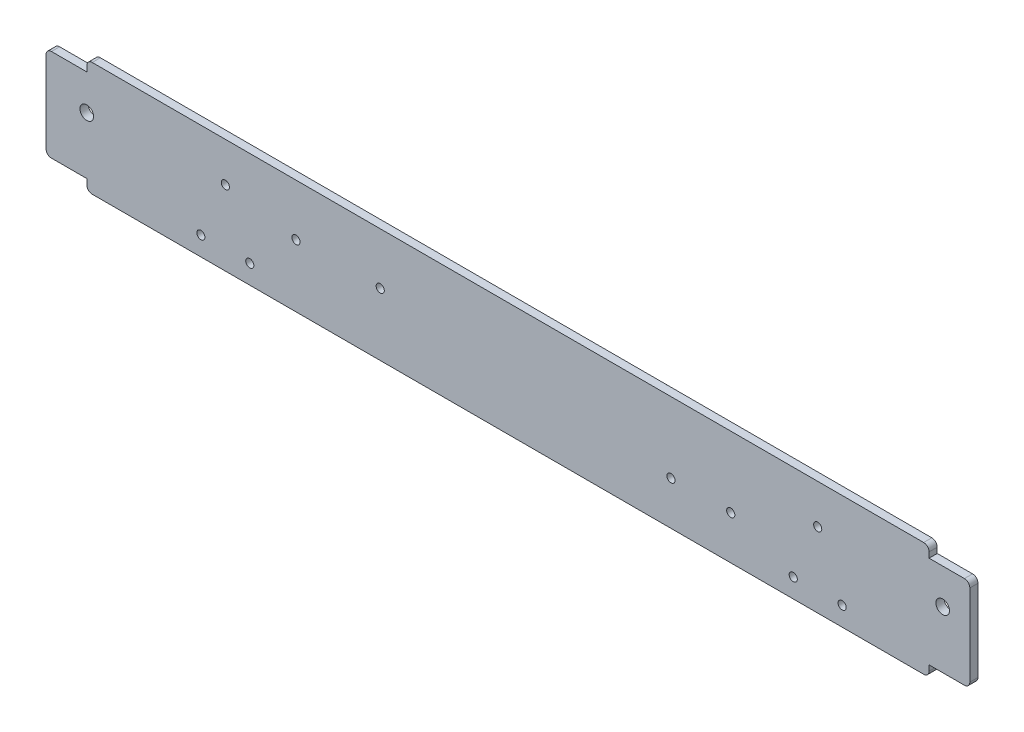
ISO-10303-21;
HEADER;
FILE_DESCRIPTION(('STEP AP214'),'2;1');
FILE_NAME('part.step','',(''),(''),'','','');
FILE_SCHEMA(('AUTOMOTIVE_DESIGN { 1 0 10303 214 1 1 1 1 }'));
ENDSEC;
DATA;
#1=APPLICATION_CONTEXT('core data for automotive mechanical design processes');
#2=APPLICATION_PROTOCOL_DEFINITION('international standard','automotive_design',2000,#1);
#3=PRODUCT_CONTEXT('',#1,'mechanical');
#4=PRODUCT('Part','Part','',(#3));
#5=PRODUCT_RELATED_PRODUCT_CATEGORY('part','',(#4));
#6=PRODUCT_DEFINITION_FORMATION('','',#4);
#7=PRODUCT_DEFINITION_CONTEXT('part definition',#1,'design');
#8=PRODUCT_DEFINITION('design','',#6,#7);
#9=PRODUCT_DEFINITION_SHAPE('','',#8);
#10=(LENGTH_UNIT() NAMED_UNIT(*) SI_UNIT(.MILLI.,.METRE.));
#11=(NAMED_UNIT(*) PLANE_ANGLE_UNIT() SI_UNIT($,.RADIAN.));
#12=(NAMED_UNIT(*) SI_UNIT($,.STERADIAN.) SOLID_ANGLE_UNIT());
#13=UNCERTAINTY_MEASURE_WITH_UNIT(LENGTH_MEASURE(1.E-05),#10,'distance_accuracy_value','');
#14=(GEOMETRIC_REPRESENTATION_CONTEXT(3) GLOBAL_UNCERTAINTY_ASSIGNED_CONTEXT((#13)) GLOBAL_UNIT_ASSIGNED_CONTEXT((#10,
#11,#12)) REPRESENTATION_CONTEXT('',''));
#15=CARTESIAN_POINT('',(0.,0.,0.));
#16=DIRECTION('',(0.,0.,1.));
#17=DIRECTION('',(1.,0.,0.));
#18=AXIS2_PLACEMENT_3D('',#15,#16,#17);
#19=CARTESIAN_POINT('',(0.,0.,3.));
#20=DIRECTION('',(0.,0.,1.));
#21=DIRECTION('',(1.,0.,0.));
#22=AXIS2_PLACEMENT_3D('',#19,#20,#21);
#23=PLANE('',#22);
#24=DIRECTION('',(0.,-1.,0.));
#25=VECTOR('',#24,1.);
#26=CARTESIAN_POINT('',(155.,17.,3.));
#27=LINE('',#26,#25);
#28=CARTESIAN_POINT('',(155.,19.,3.));
#29=VERTEX_POINT('',#28);
#30=CARTESIAN_POINT('',(155.,17.,3.));
#31=VERTEX_POINT('',#30);
#32=EDGE_CURVE('E201',#29,#31,#27,.T.);
#33=ORIENTED_EDGE('',*,*,#32,.F.);
#34=CARTESIAN_POINT('',(153.,19.,3.));
#35=DIRECTION('',(0.,0.,1.));
#36=DIRECTION('',(1.,0.,0.));
#37=AXIS2_PLACEMENT_3D('',#34,#35,#36);
#38=CIRCLE('',#37,2.);
#39=CARTESIAN_POINT('',(153.,21.,3.));
#40=VERTEX_POINT('',#39);
#41=EDGE_CURVE('E363',#29,#40,#38,.T.);
#42=ORIENTED_EDGE('',*,*,#41,.T.);
#43=DIRECTION('',(-1.,0.,0.));
#44=VECTOR('',#43,1.);
#45=CARTESIAN_POINT('',(-170.,21.,3.));
#46=LINE('',#45,#44);
#47=CARTESIAN_POINT('',(-153.,21.,3.));
#48=VERTEX_POINT('',#47);
#49=EDGE_CURVE('E327',#40,#48,#46,.T.);
#50=ORIENTED_EDGE('',*,*,#49,.T.);
#51=CARTESIAN_POINT('',(-153.,19.,3.));
#52=DIRECTION('',(0.,0.,1.));
#53=DIRECTION('',(1.,0.,0.));
#54=AXIS2_PLACEMENT_3D('',#51,#52,#53);
#55=CIRCLE('',#54,2.);
#56=CARTESIAN_POINT('',(-155.,19.,3.));
#57=VERTEX_POINT('',#56);
#58=EDGE_CURVE('E355',#48,#57,#55,.T.);
#59=ORIENTED_EDGE('',*,*,#58,.T.);
#60=DIRECTION('',(0.,-1.,0.));
#61=VECTOR('',#60,1.);
#62=CARTESIAN_POINT('',(-155.,17.,3.));
#63=LINE('',#62,#61);
#64=CARTESIAN_POINT('',(-155.,17.,3.));
#65=VERTEX_POINT('',#64);
#66=EDGE_CURVE('E230',#57,#65,#63,.T.);
#67=ORIENTED_EDGE('',*,*,#66,.T.);
#68=DIRECTION('',(-1.,0.,0.));
#69=VECTOR('',#68,1.);
#70=CARTESIAN_POINT('',(-170.,17.,3.));
#71=LINE('',#70,#69);
#72=CARTESIAN_POINT('',(-168.,17.,3.));
#73=VERTEX_POINT('',#72);
#74=EDGE_CURVE('E226',#65,#73,#71,.T.);
#75=ORIENTED_EDGE('',*,*,#74,.T.);
#76=CARTESIAN_POINT('',(-168.,15.,3.));
#77=DIRECTION('',(0.,0.,1.));
#78=DIRECTION('',(1.,0.,0.));
#79=AXIS2_PLACEMENT_3D('',#76,#77,#78);
#80=CIRCLE('',#79,2.);
#81=CARTESIAN_POINT('',(-170.,15.,3.));
#82=VERTEX_POINT('',#81);
#83=EDGE_CURVE('E353',#73,#82,#80,.T.);
#84=ORIENTED_EDGE('',*,*,#83,.T.);
#85=DIRECTION('',(0.,-1.,0.));
#86=VECTOR('',#85,1.);
#87=CARTESIAN_POINT('',(-170.,21.,3.));
#88=LINE('',#87,#86);
#89=CARTESIAN_POINT('',(-170.,-15.,3.));
#90=VERTEX_POINT('',#89);
#91=EDGE_CURVE('E331',#82,#90,#88,.T.);
#92=ORIENTED_EDGE('',*,*,#91,.T.);
#93=CARTESIAN_POINT('',(-168.,-15.,3.));
#94=DIRECTION('',(0.,0.,1.));
#95=DIRECTION('',(1.,0.,0.));
#96=AXIS2_PLACEMENT_3D('',#93,#94,#95);
#97=CIRCLE('',#96,2.);
#98=CARTESIAN_POINT('',(-168.,-17.,3.));
#99=VERTEX_POINT('',#98);
#100=EDGE_CURVE('E349',#90,#99,#97,.T.);
#101=ORIENTED_EDGE('',*,*,#100,.T.);
#102=DIRECTION('',(-1.,0.,0.));
#103=VECTOR('',#102,1.);
#104=CARTESIAN_POINT('',(-170.,-17.,3.));
#105=LINE('',#104,#103);
#106=CARTESIAN_POINT('',(-155.,-17.,3.));
#107=VERTEX_POINT('',#106);
#108=EDGE_CURVE('E242',#107,#99,#105,.T.);
#109=ORIENTED_EDGE('',*,*,#108,.F.);
#110=DIRECTION('',(0.,1.,0.));
#111=VECTOR('',#110,1.);
#112=CARTESIAN_POINT('',(-155.,-17.,3.));
#113=LINE('',#112,#111);
#114=CARTESIAN_POINT('',(-155.,-19.,3.));
#115=VERTEX_POINT('',#114);
#116=EDGE_CURVE('E238',#115,#107,#113,.T.);
#117=ORIENTED_EDGE('',*,*,#116,.F.);
#118=CARTESIAN_POINT('',(-153.,-19.,3.));
#119=DIRECTION('',(0.,0.,1.));
#120=DIRECTION('',(1.,0.,0.));
#121=AXIS2_PLACEMENT_3D('',#118,#119,#120);
#122=CIRCLE('',#121,2.);
#123=CARTESIAN_POINT('',(-153.,-21.,3.));
#124=VERTEX_POINT('',#123);
#125=EDGE_CURVE('E351',#115,#124,#122,.T.);
#126=ORIENTED_EDGE('',*,*,#125,.T.);
#127=DIRECTION('',(1.,0.,0.));
#128=VECTOR('',#127,1.);
#129=CARTESIAN_POINT('',(-170.,-21.,3.));
#130=LINE('',#129,#128);
#131=CARTESIAN_POINT('',(153.,-21.,3.));
#132=VERTEX_POINT('',#131);
#133=EDGE_CURVE('E334',#124,#132,#130,.T.);
#134=ORIENTED_EDGE('',*,*,#133,.T.);
#135=CARTESIAN_POINT('',(153.,-19.,3.));
#136=DIRECTION('',(0.,0.,1.));
#137=DIRECTION('',(1.,0.,0.));
#138=AXIS2_PLACEMENT_3D('',#135,#136,#137);
#139=CIRCLE('',#138,2.);
#140=CARTESIAN_POINT('',(155.,-19.,3.));
#141=VERTEX_POINT('',#140);
#142=EDGE_CURVE('E357',#132,#141,#139,.T.);
#143=ORIENTED_EDGE('',*,*,#142,.T.);
#144=DIRECTION('',(0.,1.,0.));
#145=VECTOR('',#144,1.);
#146=CARTESIAN_POINT('',(155.,-17.,3.));
#147=LINE('',#146,#145);
#148=CARTESIAN_POINT('',(155.,-17.,3.));
#149=VERTEX_POINT('',#148);
#150=EDGE_CURVE('E218',#141,#149,#147,.T.);
#151=ORIENTED_EDGE('',*,*,#150,.T.);
#152=DIRECTION('',(1.,0.,0.));
#153=VECTOR('',#152,1.);
#154=CARTESIAN_POINT('',(170.,-17.,3.));
#155=LINE('',#154,#153);
#156=CARTESIAN_POINT('',(168.,-17.,3.));
#157=VERTEX_POINT('',#156);
#158=EDGE_CURVE('E205',#149,#157,#155,.T.);
#159=ORIENTED_EDGE('',*,*,#158,.T.);
#160=CARTESIAN_POINT('',(168.,-15.,3.));
#161=DIRECTION('',(0.,0.,1.));
#162=DIRECTION('',(1.,0.,0.));
#163=AXIS2_PLACEMENT_3D('',#160,#161,#162);
#164=CIRCLE('',#163,2.);
#165=CARTESIAN_POINT('',(170.,-15.,3.));
#166=VERTEX_POINT('',#165);
#167=EDGE_CURVE('E359',#157,#166,#164,.T.);
#168=ORIENTED_EDGE('',*,*,#167,.T.);
#169=DIRECTION('',(0.,1.,0.));
#170=VECTOR('',#169,1.);
#171=CARTESIAN_POINT('',(170.,21.,3.));
#172=LINE('',#171,#170);
#173=CARTESIAN_POINT('',(170.,15.,3.));
#174=VERTEX_POINT('',#173);
#175=EDGE_CURVE('E324',#166,#174,#172,.T.);
#176=ORIENTED_EDGE('',*,*,#175,.T.);
#177=CARTESIAN_POINT('',(168.,15.,3.));
#178=DIRECTION('',(0.,0.,1.));
#179=DIRECTION('',(1.,0.,0.));
#180=AXIS2_PLACEMENT_3D('',#177,#178,#179);
#181=CIRCLE('',#180,2.);
#182=CARTESIAN_POINT('',(168.,17.,3.));
#183=VERTEX_POINT('',#182);
#184=EDGE_CURVE('E361',#174,#183,#181,.T.);
#185=ORIENTED_EDGE('',*,*,#184,.T.);
#186=DIRECTION('',(1.,0.,0.));
#187=VECTOR('',#186,1.);
#188=CARTESIAN_POINT('',(170.,17.,3.));
#189=LINE('',#188,#187);
#190=EDGE_CURVE('E195',#31,#183,#189,.T.);
#191=ORIENTED_EDGE('',*,*,#190,.F.);
#192=EDGE_LOOP('',(#33,#42,#50,#59,#67,#75,#84,#92,#101,#109,#117,#126,#134,#143,#151,#159,#168,
#176,#185,#191));
#193=FACE_BOUND('',#192,.T.);
#194=CARTESIAN_POINT('',(105.,-14.,3.));
#195=DIRECTION('',(0.,0.,1.));
#196=DIRECTION('',(1.,0.,0.));
#197=AXIS2_PLACEMENT_3D('',#194,#195,#196);
#198=CIRCLE('',#197,1.5);
#199=CARTESIAN_POINT('',(106.5,-14.,3.));
#200=VERTEX_POINT('',#199);
#201=EDGE_CURVE('E258',#200,#200,#198,.T.);
#202=ORIENTED_EDGE('',*,*,#201,.F.);
#203=EDGE_LOOP('',(#202));
#204=FACE_BOUND('',#203,.T.);
#205=CARTESIAN_POINT('',(160.,4.,3.));
#206=DIRECTION('',(0.,0.,1.));
#207=DIRECTION('',(1.,0.,0.));
#208=AXIS2_PLACEMENT_3D('',#205,#206,#207);
#209=CIRCLE('',#208,2.5);
#210=CARTESIAN_POINT('',(162.5,4.,3.));
#211=VERTEX_POINT('',#210);
#212=EDGE_CURVE('E270',#211,#211,#209,.T.);
#213=ORIENTED_EDGE('',*,*,#212,.F.);
#214=EDGE_LOOP('',(#213));
#215=FACE_BOUND('',#214,.T.);
#216=CARTESIAN_POINT('',(-95.,-14.,3.));
#217=DIRECTION('',(0.,0.,1.));
#218=DIRECTION('',(1.,0.,0.));
#219=AXIS2_PLACEMENT_3D('',#216,#217,#218);
#220=CIRCLE('',#219,1.5);
#221=CARTESIAN_POINT('',(-93.5,-14.,3.));
#222=VERTEX_POINT('',#221);
#223=EDGE_CURVE('E282',#222,#222,#220,.T.);
#224=ORIENTED_EDGE('',*,*,#223,.F.);
#225=EDGE_LOOP('',(#224));
#226=FACE_BOUND('',#225,.T.);
#227=CARTESIAN_POINT('',(-104.,6.5,3.));
#228=DIRECTION('',(0.,0.,1.));
#229=DIRECTION('',(1.,0.,0.));
#230=AXIS2_PLACEMENT_3D('',#227,#228,#229);
#231=CIRCLE('',#230,1.5);
#232=CARTESIAN_POINT('',(-102.5,6.5,3.));
#233=VERTEX_POINT('',#232);
#234=EDGE_CURVE('E294',#233,#233,#231,.T.);
#235=ORIENTED_EDGE('',*,*,#234,.F.);
#236=EDGE_LOOP('',(#235));
#237=FACE_BOUND('',#236,.T.);
#238=CARTESIAN_POINT('',(-47.,2.,3.));
#239=DIRECTION('',(0.,0.,1.));
#240=DIRECTION('',(1.,0.,0.));
#241=AXIS2_PLACEMENT_3D('',#238,#239,#240);
#242=CIRCLE('',#241,1.5);
#243=CARTESIAN_POINT('',(-45.5,2.,3.));
#244=VERTEX_POINT('',#243);
#245=EDGE_CURVE('E306',#244,#244,#242,.T.);
#246=ORIENTED_EDGE('',*,*,#245,.F.);
#247=EDGE_LOOP('',(#246));
#248=FACE_BOUND('',#247,.T.);
#249=CARTESIAN_POINT('',(82.,-5.,3.));
#250=DIRECTION('',(0.,0.,1.));
#251=DIRECTION('',(1.,0.,0.));
#252=AXIS2_PLACEMENT_3D('',#249,#250,#251);
#253=CIRCLE('',#252,1.5);
#254=CARTESIAN_POINT('',(83.5,-5.,3.));
#255=VERTEX_POINT('',#254);
#256=EDGE_CURVE('E318',#255,#255,#253,.T.);
#257=ORIENTED_EDGE('',*,*,#256,.F.);
#258=EDGE_LOOP('',(#257));
#259=FACE_BOUND('',#258,.T.);
#260=CARTESIAN_POINT('',(60.,-5.,3.));
#261=DIRECTION('',(0.,0.,1.));
#262=DIRECTION('',(1.,0.,0.));
#263=AXIS2_PLACEMENT_3D('',#260,#261,#262);
#264=CIRCLE('',#263,1.5);
#265=CARTESIAN_POINT('',(61.5,-5.,3.));
#266=VERTEX_POINT('',#265);
#267=EDGE_CURVE('E312',#266,#266,#264,.T.);
#268=ORIENTED_EDGE('',*,*,#267,.F.);
#269=EDGE_LOOP('',(#268));
#270=FACE_BOUND('',#269,.T.);
#271=CARTESIAN_POINT('',(-78.,2.,3.));
#272=DIRECTION('',(0.,0.,1.));
#273=DIRECTION('',(1.,0.,0.));
#274=AXIS2_PLACEMENT_3D('',#271,#272,#273);
#275=CIRCLE('',#274,1.5);
#276=CARTESIAN_POINT('',(-76.5,2.,3.));
#277=VERTEX_POINT('',#276);
#278=EDGE_CURVE('E300',#277,#277,#275,.T.);
#279=ORIENTED_EDGE('',*,*,#278,.F.);
#280=EDGE_LOOP('',(#279));
#281=FACE_BOUND('',#280,.T.);
#282=CARTESIAN_POINT('',(-113.,-14.,3.));
#283=DIRECTION('',(0.,0.,1.));
#284=DIRECTION('',(1.,0.,0.));
#285=AXIS2_PLACEMENT_3D('',#282,#283,#284);
#286=CIRCLE('',#285,1.5);
#287=CARTESIAN_POINT('',(-111.5,-14.,3.));
#288=VERTEX_POINT('',#287);
#289=EDGE_CURVE('E288',#288,#288,#286,.T.);
#290=ORIENTED_EDGE('',*,*,#289,.F.);
#291=EDGE_LOOP('',(#290));
#292=FACE_BOUND('',#291,.T.);
#293=CARTESIAN_POINT('',(-155.,4.,3.));
#294=DIRECTION('',(0.,0.,1.));
#295=DIRECTION('',(1.,0.,0.));
#296=AXIS2_PLACEMENT_3D('',#293,#294,#295);
#297=CIRCLE('',#296,2.5);
#298=CARTESIAN_POINT('',(-152.5,4.,3.));
#299=VERTEX_POINT('',#298);
#300=EDGE_CURVE('E276',#299,#299,#297,.T.);
#301=ORIENTED_EDGE('',*,*,#300,.F.);
#302=EDGE_LOOP('',(#301));
#303=FACE_BOUND('',#302,.T.);
#304=CARTESIAN_POINT('',(114.,6.5,3.));
#305=DIRECTION('',(0.,0.,1.));
#306=DIRECTION('',(1.,0.,0.));
#307=AXIS2_PLACEMENT_3D('',#304,#305,#306);
#308=CIRCLE('',#307,1.5);
#309=CARTESIAN_POINT('',(115.5,6.5,3.));
#310=VERTEX_POINT('',#309);
#311=EDGE_CURVE('E264',#310,#310,#308,.T.);
#312=ORIENTED_EDGE('',*,*,#311,.F.);
#313=EDGE_LOOP('',(#312));
#314=FACE_BOUND('',#313,.T.);
#315=CARTESIAN_POINT('',(123.,-14.,3.));
#316=DIRECTION('',(0.,0.,1.));
#317=DIRECTION('',(1.,0.,0.));
#318=AXIS2_PLACEMENT_3D('',#315,#316,#317);
#319=CIRCLE('',#318,1.5);
#320=CARTESIAN_POINT('',(124.5,-14.,3.));
#321=VERTEX_POINT('',#320);
#322=EDGE_CURVE('E252',#321,#321,#319,.T.);
#323=ORIENTED_EDGE('',*,*,#322,.F.);
#324=EDGE_LOOP('',(#323));
#325=FACE_BOUND('',#324,.T.);
#326=ADVANCED_FACE('F45',(#193,#204,#215,#226,#237,#248,#259,#270,#281,#292,#303,#314,#325),#23,.T.);
#327=CARTESIAN_POINT('',(0.,0.,0.));
#328=DIRECTION('',(0.,0.,1.));
#329=DIRECTION('',(1.,0.,0.));
#330=AXIS2_PLACEMENT_3D('',#327,#328,#329);
#331=PLANE('',#330);
#332=CARTESIAN_POINT('',(82.,-5.,0.));
#333=DIRECTION('',(0.,0.,1.));
#334=DIRECTION('',(1.,0.,0.));
#335=AXIS2_PLACEMENT_3D('',#332,#333,#334);
#336=CIRCLE('',#335,1.5);
#337=CARTESIAN_POINT('',(83.5,-5.,0.));
#338=VERTEX_POINT('',#337);
#339=EDGE_CURVE('E315',#338,#338,#336,.T.);
#340=ORIENTED_EDGE('',*,*,#339,.T.);
#341=EDGE_LOOP('',(#340));
#342=FACE_BOUND('',#341,.T.);
#343=CARTESIAN_POINT('',(60.,-5.,0.));
#344=DIRECTION('',(0.,0.,1.));
#345=DIRECTION('',(1.,0.,0.));
#346=AXIS2_PLACEMENT_3D('',#343,#344,#345);
#347=CIRCLE('',#346,1.5);
#348=CARTESIAN_POINT('',(61.5,-5.,0.));
#349=VERTEX_POINT('',#348);
#350=EDGE_CURVE('E309',#349,#349,#347,.T.);
#351=ORIENTED_EDGE('',*,*,#350,.T.);
#352=EDGE_LOOP('',(#351));
#353=FACE_BOUND('',#352,.T.);
#354=CARTESIAN_POINT('',(-47.,2.,0.));
#355=DIRECTION('',(0.,0.,1.));
#356=DIRECTION('',(1.,0.,0.));
#357=AXIS2_PLACEMENT_3D('',#354,#355,#356);
#358=CIRCLE('',#357,1.5);
#359=CARTESIAN_POINT('',(-45.5,2.,0.));
#360=VERTEX_POINT('',#359);
#361=EDGE_CURVE('E303',#360,#360,#358,.T.);
#362=ORIENTED_EDGE('',*,*,#361,.T.);
#363=EDGE_LOOP('',(#362));
#364=FACE_BOUND('',#363,.T.);
#365=CARTESIAN_POINT('',(-78.,2.,0.));
#366=DIRECTION('',(0.,0.,1.));
#367=DIRECTION('',(1.,0.,0.));
#368=AXIS2_PLACEMENT_3D('',#365,#366,#367);
#369=CIRCLE('',#368,1.5);
#370=CARTESIAN_POINT('',(-76.5,2.,0.));
#371=VERTEX_POINT('',#370);
#372=EDGE_CURVE('E297',#371,#371,#369,.T.);
#373=ORIENTED_EDGE('',*,*,#372,.T.);
#374=EDGE_LOOP('',(#373));
#375=FACE_BOUND('',#374,.T.);
#376=CARTESIAN_POINT('',(-104.,6.5,0.));
#377=DIRECTION('',(0.,0.,1.));
#378=DIRECTION('',(1.,0.,0.));
#379=AXIS2_PLACEMENT_3D('',#376,#377,#378);
#380=CIRCLE('',#379,1.5);
#381=CARTESIAN_POINT('',(-102.5,6.5,0.));
#382=VERTEX_POINT('',#381);
#383=EDGE_CURVE('E291',#382,#382,#380,.T.);
#384=ORIENTED_EDGE('',*,*,#383,.T.);
#385=EDGE_LOOP('',(#384));
#386=FACE_BOUND('',#385,.T.);
#387=CARTESIAN_POINT('',(-113.,-14.,0.));
#388=DIRECTION('',(0.,0.,1.));
#389=DIRECTION('',(1.,0.,0.));
#390=AXIS2_PLACEMENT_3D('',#387,#388,#389);
#391=CIRCLE('',#390,1.5);
#392=CARTESIAN_POINT('',(-111.5,-14.,0.));
#393=VERTEX_POINT('',#392);
#394=EDGE_CURVE('E285',#393,#393,#391,.T.);
#395=ORIENTED_EDGE('',*,*,#394,.T.);
#396=EDGE_LOOP('',(#395));
#397=FACE_BOUND('',#396,.T.);
#398=CARTESIAN_POINT('',(-95.,-14.,0.));
#399=DIRECTION('',(0.,0.,1.));
#400=DIRECTION('',(1.,0.,0.));
#401=AXIS2_PLACEMENT_3D('',#398,#399,#400);
#402=CIRCLE('',#401,1.5);
#403=CARTESIAN_POINT('',(-93.5,-14.,0.));
#404=VERTEX_POINT('',#403);
#405=EDGE_CURVE('E279',#404,#404,#402,.T.);
#406=ORIENTED_EDGE('',*,*,#405,.T.);
#407=EDGE_LOOP('',(#406));
#408=FACE_BOUND('',#407,.T.);
#409=CARTESIAN_POINT('',(-155.,4.,0.));
#410=DIRECTION('',(0.,0.,1.));
#411=DIRECTION('',(1.,0.,0.));
#412=AXIS2_PLACEMENT_3D('',#409,#410,#411);
#413=CIRCLE('',#412,2.5);
#414=CARTESIAN_POINT('',(-152.5,4.,0.));
#415=VERTEX_POINT('',#414);
#416=EDGE_CURVE('E273',#415,#415,#413,.T.);
#417=ORIENTED_EDGE('',*,*,#416,.T.);
#418=EDGE_LOOP('',(#417));
#419=FACE_BOUND('',#418,.T.);
#420=CARTESIAN_POINT('',(160.,4.,0.));
#421=DIRECTION('',(0.,0.,1.));
#422=DIRECTION('',(1.,0.,0.));
#423=AXIS2_PLACEMENT_3D('',#420,#421,#422);
#424=CIRCLE('',#423,2.5);
#425=CARTESIAN_POINT('',(162.5,4.,0.));
#426=VERTEX_POINT('',#425);
#427=EDGE_CURVE('E267',#426,#426,#424,.T.);
#428=ORIENTED_EDGE('',*,*,#427,.T.);
#429=EDGE_LOOP('',(#428));
#430=FACE_BOUND('',#429,.T.);
#431=CARTESIAN_POINT('',(114.,6.5,0.));
#432=DIRECTION('',(0.,0.,1.));
#433=DIRECTION('',(1.,0.,0.));
#434=AXIS2_PLACEMENT_3D('',#431,#432,#433);
#435=CIRCLE('',#434,1.5);
#436=CARTESIAN_POINT('',(115.5,6.5,0.));
#437=VERTEX_POINT('',#436);
#438=EDGE_CURVE('E261',#437,#437,#435,.T.);
#439=ORIENTED_EDGE('',*,*,#438,.T.);
#440=EDGE_LOOP('',(#439));
#441=FACE_BOUND('',#440,.T.);
#442=CARTESIAN_POINT('',(105.,-14.,0.));
#443=DIRECTION('',(0.,0.,1.));
#444=DIRECTION('',(1.,0.,0.));
#445=AXIS2_PLACEMENT_3D('',#442,#443,#444);
#446=CIRCLE('',#445,1.5);
#447=CARTESIAN_POINT('',(106.5,-14.,0.));
#448=VERTEX_POINT('',#447);
#449=EDGE_CURVE('E255',#448,#448,#446,.T.);
#450=ORIENTED_EDGE('',*,*,#449,.T.);
#451=EDGE_LOOP('',(#450));
#452=FACE_BOUND('',#451,.T.);
#453=CARTESIAN_POINT('',(123.,-14.,0.));
#454=DIRECTION('',(0.,0.,1.));
#455=DIRECTION('',(1.,0.,0.));
#456=AXIS2_PLACEMENT_3D('',#453,#454,#455);
#457=CIRCLE('',#456,1.5);
#458=CARTESIAN_POINT('',(124.5,-14.,0.));
#459=VERTEX_POINT('',#458);
#460=EDGE_CURVE('E251',#459,#459,#457,.T.);
#461=ORIENTED_EDGE('',*,*,#460,.T.);
#462=EDGE_LOOP('',(#461));
#463=FACE_BOUND('',#462,.T.);
#464=DIRECTION('',(-1.,0.,0.));
#465=VECTOR('',#464,1.);
#466=CARTESIAN_POINT('',(-170.,21.,0.));
#467=LINE('',#466,#465);
#468=CARTESIAN_POINT('',(153.,21.,0.));
#469=VERTEX_POINT('',#468);
#470=CARTESIAN_POINT('',(-153.,21.,0.));
#471=VERTEX_POINT('',#470);
#472=EDGE_CURVE('E340',#469,#471,#467,.T.);
#473=ORIENTED_EDGE('',*,*,#472,.F.);
#474=CARTESIAN_POINT('',(153.,19.,0.));
#475=DIRECTION('',(0.,0.,1.));
#476=DIRECTION('',(1.,0.,0.));
#477=AXIS2_PLACEMENT_3D('',#474,#475,#476);
#478=CIRCLE('',#477,2.);
#479=CARTESIAN_POINT('',(155.,19.,0.));
#480=VERTEX_POINT('',#479);
#481=EDGE_CURVE('E191',#469,#480,#478,.F.);
#482=ORIENTED_EDGE('',*,*,#481,.T.);
#483=DIRECTION('',(0.,-1.,0.));
#484=VECTOR('',#483,1.);
#485=CARTESIAN_POINT('',(155.,17.,0.));
#486=LINE('',#485,#484);
#487=CARTESIAN_POINT('',(155.,17.,0.));
#488=VERTEX_POINT('',#487);
#489=EDGE_CURVE('E183',#480,#488,#486,.T.);
#490=ORIENTED_EDGE('',*,*,#489,.T.);
#491=DIRECTION('',(1.,0.,0.));
#492=VECTOR('',#491,1.);
#493=CARTESIAN_POINT('',(170.,17.,0.));
#494=LINE('',#493,#492);
#495=CARTESIAN_POINT('',(168.,17.,0.));
#496=VERTEX_POINT('',#495);
#497=EDGE_CURVE('E188',#488,#496,#494,.T.);
#498=ORIENTED_EDGE('',*,*,#497,.T.);
#499=CARTESIAN_POINT('',(168.,15.,0.));
#500=DIRECTION('',(0.,0.,1.));
#501=DIRECTION('',(1.,0.,0.));
#502=AXIS2_PLACEMENT_3D('',#499,#500,#501);
#503=CIRCLE('',#502,2.);
#504=CARTESIAN_POINT('',(170.,15.,0.));
#505=VERTEX_POINT('',#504);
#506=EDGE_CURVE('E381',#496,#505,#503,.F.);
#507=ORIENTED_EDGE('',*,*,#506,.T.);
#508=DIRECTION('',(0.,1.,0.));
#509=VECTOR('',#508,1.);
#510=CARTESIAN_POINT('',(170.,21.,0.));
#511=LINE('',#510,#509);
#512=CARTESIAN_POINT('',(170.,-15.,0.));
#513=VERTEX_POINT('',#512);
#514=EDGE_CURVE('E321',#513,#505,#511,.T.);
#515=ORIENTED_EDGE('',*,*,#514,.F.);
#516=CARTESIAN_POINT('',(168.,-15.,0.));
#517=DIRECTION('',(0.,0.,1.));
#518=DIRECTION('',(1.,0.,0.));
#519=AXIS2_PLACEMENT_3D('',#516,#517,#518);
#520=CIRCLE('',#519,2.);
#521=CARTESIAN_POINT('',(168.,-17.,0.));
#522=VERTEX_POINT('',#521);
#523=EDGE_CURVE('E379',#513,#522,#520,.F.);
#524=ORIENTED_EDGE('',*,*,#523,.T.);
#525=DIRECTION('',(1.,0.,0.));
#526=VECTOR('',#525,1.);
#527=CARTESIAN_POINT('',(170.,-17.,0.));
#528=LINE('',#527,#526);
#529=CARTESIAN_POINT('',(155.,-17.,0.));
#530=VERTEX_POINT('',#529);
#531=EDGE_CURVE('E214',#530,#522,#528,.T.);
#532=ORIENTED_EDGE('',*,*,#531,.F.);
#533=DIRECTION('',(0.,1.,0.));
#534=VECTOR('',#533,1.);
#535=CARTESIAN_POINT('',(155.,-17.,0.));
#536=LINE('',#535,#534);
#537=CARTESIAN_POINT('',(155.,-19.,0.));
#538=VERTEX_POINT('',#537);
#539=EDGE_CURVE('E217',#538,#530,#536,.T.);
#540=ORIENTED_EDGE('',*,*,#539,.F.);
#541=CARTESIAN_POINT('',(153.,-19.,0.));
#542=DIRECTION('',(0.,0.,1.));
#543=DIRECTION('',(1.,0.,0.));
#544=AXIS2_PLACEMENT_3D('',#541,#542,#543);
#545=CIRCLE('',#544,2.);
#546=CARTESIAN_POINT('',(153.,-21.,0.));
#547=VERTEX_POINT('',#546);
#548=EDGE_CURVE('E377',#538,#547,#545,.F.);
#549=ORIENTED_EDGE('',*,*,#548,.T.);
#550=DIRECTION('',(1.,0.,0.));
#551=VECTOR('',#550,1.);
#552=CARTESIAN_POINT('',(-170.,-21.,0.));
#553=LINE('',#552,#551);
#554=CARTESIAN_POINT('',(-153.,-21.,0.));
#555=VERTEX_POINT('',#554);
#556=EDGE_CURVE('E328',#555,#547,#553,.T.);
#557=ORIENTED_EDGE('',*,*,#556,.F.);
#558=CARTESIAN_POINT('',(-153.,-19.,0.));
#559=DIRECTION('',(0.,0.,1.));
#560=DIRECTION('',(1.,0.,0.));
#561=AXIS2_PLACEMENT_3D('',#558,#559,#560);
#562=CIRCLE('',#561,2.);
#563=CARTESIAN_POINT('',(-155.,-19.,0.));
#564=VERTEX_POINT('',#563);
#565=EDGE_CURVE('E372',#555,#564,#562,.F.);
#566=ORIENTED_EDGE('',*,*,#565,.T.);
#567=DIRECTION('',(0.,1.,0.));
#568=VECTOR('',#567,1.);
#569=CARTESIAN_POINT('',(-155.,-17.,0.));
#570=LINE('',#569,#568);
#571=CARTESIAN_POINT('',(-155.,-17.,0.));
#572=VERTEX_POINT('',#571);
#573=EDGE_CURVE('E239',#564,#572,#570,.T.);
#574=ORIENTED_EDGE('',*,*,#573,.T.);
#575=DIRECTION('',(-1.,0.,0.));
#576=VECTOR('',#575,1.);
#577=CARTESIAN_POINT('',(-170.,-17.,0.));
#578=LINE('',#577,#576);
#579=CARTESIAN_POINT('',(-168.,-17.,0.));
#580=VERTEX_POINT('',#579);
#581=EDGE_CURVE('E241',#572,#580,#578,.T.);
#582=ORIENTED_EDGE('',*,*,#581,.T.);
#583=CARTESIAN_POINT('',(-168.,-15.,0.));
#584=DIRECTION('',(0.,0.,1.));
#585=DIRECTION('',(1.,0.,0.));
#586=AXIS2_PLACEMENT_3D('',#583,#584,#585);
#587=CIRCLE('',#586,2.);
#588=CARTESIAN_POINT('',(-170.,-15.,0.));
#589=VERTEX_POINT('',#588);
#590=EDGE_CURVE('E370',#580,#589,#587,.F.);
#591=ORIENTED_EDGE('',*,*,#590,.T.);
#592=DIRECTION('',(0.,-1.,0.));
#593=VECTOR('',#592,1.);
#594=CARTESIAN_POINT('',(-170.,21.,0.));
#595=LINE('',#594,#593);
#596=CARTESIAN_POINT('',(-170.,15.,0.));
#597=VERTEX_POINT('',#596);
#598=EDGE_CURVE('E343',#597,#589,#595,.T.);
#599=ORIENTED_EDGE('',*,*,#598,.F.);
#600=CARTESIAN_POINT('',(-168.,15.,0.));
#601=DIRECTION('',(0.,0.,1.));
#602=DIRECTION('',(1.,0.,0.));
#603=AXIS2_PLACEMENT_3D('',#600,#601,#602);
#604=CIRCLE('',#603,2.);
#605=CARTESIAN_POINT('',(-168.,17.,0.));
#606=VERTEX_POINT('',#605);
#607=EDGE_CURVE('E68',#597,#606,#604,.F.);
#608=ORIENTED_EDGE('',*,*,#607,.T.);
#609=DIRECTION('',(-1.,0.,0.));
#610=VECTOR('',#609,1.);
#611=CARTESIAN_POINT('',(-170.,17.,0.));
#612=LINE('',#611,#610);
#613=CARTESIAN_POINT('',(-155.,17.,0.));
#614=VERTEX_POINT('',#613);
#615=EDGE_CURVE('E227',#614,#606,#612,.T.);
#616=ORIENTED_EDGE('',*,*,#615,.F.);
#617=DIRECTION('',(0.,-1.,0.));
#618=VECTOR('',#617,1.);
#619=CARTESIAN_POINT('',(-155.,17.,0.));
#620=LINE('',#619,#618);
#621=CARTESIAN_POINT('',(-155.,19.,0.));
#622=VERTEX_POINT('',#621);
#623=EDGE_CURVE('E229',#622,#614,#620,.T.);
#624=ORIENTED_EDGE('',*,*,#623,.F.);
#625=CARTESIAN_POINT('',(-153.,19.,0.));
#626=DIRECTION('',(0.,0.,1.));
#627=DIRECTION('',(1.,0.,0.));
#628=AXIS2_PLACEMENT_3D('',#625,#626,#627);
#629=CIRCLE('',#628,2.);
#630=EDGE_CURVE('E375',#622,#471,#629,.F.);
#631=ORIENTED_EDGE('',*,*,#630,.T.);
#632=EDGE_LOOP('',(#473,#482,#490,#498,#507,#515,#524,#532,#540,#549,#557,#566,#574,#582,#591,
#599,#608,#616,#624,#631));
#633=FACE_BOUND('',#632,.T.);
#634=ADVANCED_FACE('F186',(#342,#353,#364,#375,#386,#397,#408,#419,#430,#441,#452,#463,#633),
#331,.F.);
#635=CARTESIAN_POINT('',(170.,21.,3.));
#636=DIRECTION('',(-1.,0.,0.));
#637=DIRECTION('',(0.,0.,1.));
#638=AXIS2_PLACEMENT_3D('',#635,#636,#637);
#639=PLANE('',#638);
#640=ORIENTED_EDGE('',*,*,#514,.T.);
#641=DIRECTION('',(0.,0.,1.));
#642=VECTOR('',#641,1.);
#643=CARTESIAN_POINT('',(170.,15.,3.));
#644=LINE('',#643,#642);
#645=EDGE_CURVE('E386',#505,#174,#644,.T.);
#646=ORIENTED_EDGE('',*,*,#645,.T.);
#647=ORIENTED_EDGE('',*,*,#175,.F.);
#648=DIRECTION('',(0.,0.,1.));
#649=VECTOR('',#648,1.);
#650=CARTESIAN_POINT('',(170.,-15.,0.));
#651=LINE('',#650,#649);
#652=EDGE_CURVE('E384',#166,#513,#651,.F.);
#653=ORIENTED_EDGE('',*,*,#652,.T.);
#654=EDGE_LOOP('',(#640,#646,#647,#653));
#655=FACE_BOUND('',#654,.T.);
#656=ADVANCED_FACE('F468',(#655),#639,.F.);
#657=CARTESIAN_POINT('',(-170.,-21.,3.));
#658=DIRECTION('',(0.,1.,0.));
#659=DIRECTION('',(0.,0.,1.));
#660=AXIS2_PLACEMENT_3D('',#657,#658,#659);
#661=PLANE('',#660);
#662=ORIENTED_EDGE('',*,*,#556,.T.);
#663=DIRECTION('',(0.,0.,1.));
#664=VECTOR('',#663,1.);
#665=CARTESIAN_POINT('',(153.,-21.,3.));
#666=LINE('',#665,#664);
#667=EDGE_CURVE('E395',#547,#132,#666,.T.);
#668=ORIENTED_EDGE('',*,*,#667,.T.);
#669=ORIENTED_EDGE('',*,*,#133,.F.);
#670=DIRECTION('',(0.,0.,1.));
#671=VECTOR('',#670,1.);
#672=CARTESIAN_POINT('',(-153.,-21.,3.));
#673=LINE('',#672,#671);
#674=EDGE_CURVE('E393',#124,#555,#673,.F.);
#675=ORIENTED_EDGE('',*,*,#674,.T.);
#676=EDGE_LOOP('',(#662,#668,#669,#675));
#677=FACE_BOUND('',#676,.T.);
#678=ADVANCED_FACE('F475',(#677),#661,.F.);
#679=CARTESIAN_POINT('',(-170.,21.,3.));
#680=DIRECTION('',(0.,-1.,0.));
#681=DIRECTION('',(0.,0.,-1.));
#682=AXIS2_PLACEMENT_3D('',#679,#680,#681);
#683=PLANE('',#682);
#684=ORIENTED_EDGE('',*,*,#49,.F.);
#685=DIRECTION('',(0.,0.,1.));
#686=VECTOR('',#685,1.);
#687=CARTESIAN_POINT('',(153.,21.,3.));
#688=LINE('',#687,#686);
#689=EDGE_CURVE('E368',#40,#469,#688,.F.);
#690=ORIENTED_EDGE('',*,*,#689,.T.);
#691=ORIENTED_EDGE('',*,*,#472,.T.);
#692=DIRECTION('',(0.,0.,1.));
#693=VECTOR('',#692,1.);
#694=CARTESIAN_POINT('',(-153.,21.,3.));
#695=LINE('',#694,#693);
#696=EDGE_CURVE('E365',#471,#48,#695,.T.);
#697=ORIENTED_EDGE('',*,*,#696,.T.);
#698=EDGE_LOOP('',(#684,#690,#691,#697));
#699=FACE_BOUND('',#698,.T.);
#700=ADVANCED_FACE('F446',(#699),#683,.F.);
#701=CARTESIAN_POINT('',(-170.,21.,3.));
#702=DIRECTION('',(1.,0.,0.));
#703=DIRECTION('',(0.,0.,-1.));
#704=AXIS2_PLACEMENT_3D('',#701,#702,#703);
#705=PLANE('',#704);
#706=ORIENTED_EDGE('',*,*,#91,.F.);
#707=DIRECTION('',(0.,0.,1.));
#708=VECTOR('',#707,1.);
#709=CARTESIAN_POINT('',(-170.,15.,0.));
#710=LINE('',#709,#708);
#711=EDGE_CURVE('E407',#82,#597,#710,.F.);
#712=ORIENTED_EDGE('',*,*,#711,.T.);
#713=ORIENTED_EDGE('',*,*,#598,.T.);
#714=DIRECTION('',(0.,0.,1.));
#715=VECTOR('',#714,1.);
#716=CARTESIAN_POINT('',(-170.,-15.,3.));
#717=LINE('',#716,#715);
#718=EDGE_CURVE('E404',#589,#90,#717,.T.);
#719=ORIENTED_EDGE('',*,*,#718,.T.);
#720=EDGE_LOOP('',(#706,#712,#713,#719));
#721=FACE_BOUND('',#720,.T.);
#722=ADVANCED_FACE('F430',(#721),#705,.F.);
#723=CARTESIAN_POINT('',(82.,-5.,3.));
#724=DIRECTION('',(0.,0.,-1.));
#725=DIRECTION('',(-1.,0.,0.));
#726=AXIS2_PLACEMENT_3D('',#723,#724,#725);
#727=CYLINDRICAL_SURFACE('',#726,1.5);
#728=ORIENTED_EDGE('',*,*,#256,.T.);
#729=EDGE_LOOP('',(#728));
#730=FACE_BOUND('',#729,.T.);
#731=ORIENTED_EDGE('',*,*,#339,.F.);
#732=EDGE_LOOP('',(#731));
#733=FACE_BOUND('',#732,.T.);
#734=ADVANCED_FACE('F472',(#730,#733),#727,.F.);
#735=CARTESIAN_POINT('',(60.,-5.,3.));
#736=DIRECTION('',(0.,0.,-1.));
#737=DIRECTION('',(-1.,0.,0.));
#738=AXIS2_PLACEMENT_3D('',#735,#736,#737);
#739=CYLINDRICAL_SURFACE('',#738,1.5);
#740=ORIENTED_EDGE('',*,*,#267,.T.);
#741=EDGE_LOOP('',(#740));
#742=FACE_BOUND('',#741,.T.);
#743=ORIENTED_EDGE('',*,*,#350,.F.);
#744=EDGE_LOOP('',(#743));
#745=FACE_BOUND('',#744,.T.);
#746=ADVANCED_FACE('F848',(#742,#745),#739,.F.);
#747=CARTESIAN_POINT('',(-47.,2.,3.));
#748=DIRECTION('',(0.,0.,-1.));
#749=DIRECTION('',(-1.,0.,0.));
#750=AXIS2_PLACEMENT_3D('',#747,#748,#749);
#751=CYLINDRICAL_SURFACE('',#750,1.5);
#752=ORIENTED_EDGE('',*,*,#245,.T.);
#753=EDGE_LOOP('',(#752));
#754=FACE_BOUND('',#753,.T.);
#755=ORIENTED_EDGE('',*,*,#361,.F.);
#756=EDGE_LOOP('',(#755));
#757=FACE_BOUND('',#756,.T.);
#758=ADVANCED_FACE('F839',(#754,#757),#751,.F.);
#759=CARTESIAN_POINT('',(-78.,2.,3.));
#760=DIRECTION('',(0.,0.,-1.));
#761=DIRECTION('',(-1.,0.,0.));
#762=AXIS2_PLACEMENT_3D('',#759,#760,#761);
#763=CYLINDRICAL_SURFACE('',#762,1.5);
#764=ORIENTED_EDGE('',*,*,#278,.T.);
#765=EDGE_LOOP('',(#764));
#766=FACE_BOUND('',#765,.T.);
#767=ORIENTED_EDGE('',*,*,#372,.F.);
#768=EDGE_LOOP('',(#767));
#769=FACE_BOUND('',#768,.T.);
#770=ADVANCED_FACE('F830',(#766,#769),#763,.F.);
#771=CARTESIAN_POINT('',(-104.,6.5,3.));
#772=DIRECTION('',(0.,0.,-1.));
#773=DIRECTION('',(-1.,0.,0.));
#774=AXIS2_PLACEMENT_3D('',#771,#772,#773);
#775=CYLINDRICAL_SURFACE('',#774,1.5);
#776=ORIENTED_EDGE('',*,*,#234,.T.);
#777=EDGE_LOOP('',(#776));
#778=FACE_BOUND('',#777,.T.);
#779=ORIENTED_EDGE('',*,*,#383,.F.);
#780=EDGE_LOOP('',(#779));
#781=FACE_BOUND('',#780,.T.);
#782=ADVANCED_FACE('F821',(#778,#781),#775,.F.);
#783=CARTESIAN_POINT('',(-113.,-14.,3.));
#784=DIRECTION('',(0.,0.,-1.));
#785=DIRECTION('',(-1.,0.,0.));
#786=AXIS2_PLACEMENT_3D('',#783,#784,#785);
#787=CYLINDRICAL_SURFACE('',#786,1.5);
#788=ORIENTED_EDGE('',*,*,#289,.T.);
#789=EDGE_LOOP('',(#788));
#790=FACE_BOUND('',#789,.T.);
#791=ORIENTED_EDGE('',*,*,#394,.F.);
#792=EDGE_LOOP('',(#791));
#793=FACE_BOUND('',#792,.T.);
#794=ADVANCED_FACE('F812',(#790,#793),#787,.F.);
#795=CARTESIAN_POINT('',(-95.,-14.,3.));
#796=DIRECTION('',(0.,0.,-1.));
#797=DIRECTION('',(-1.,0.,0.));
#798=AXIS2_PLACEMENT_3D('',#795,#796,#797);
#799=CYLINDRICAL_SURFACE('',#798,1.5);
#800=ORIENTED_EDGE('',*,*,#223,.T.);
#801=EDGE_LOOP('',(#800));
#802=FACE_BOUND('',#801,.T.);
#803=ORIENTED_EDGE('',*,*,#405,.F.);
#804=EDGE_LOOP('',(#803));
#805=FACE_BOUND('',#804,.T.);
#806=ADVANCED_FACE('F803',(#802,#805),#799,.F.);
#807=CARTESIAN_POINT('',(-155.,4.,3.));
#808=DIRECTION('',(0.,0.,-1.));
#809=DIRECTION('',(-1.,0.,0.));
#810=AXIS2_PLACEMENT_3D('',#807,#808,#809);
#811=CYLINDRICAL_SURFACE('',#810,2.5);
#812=ORIENTED_EDGE('',*,*,#300,.T.);
#813=EDGE_LOOP('',(#812));
#814=FACE_BOUND('',#813,.T.);
#815=ORIENTED_EDGE('',*,*,#416,.F.);
#816=EDGE_LOOP('',(#815));
#817=FACE_BOUND('',#816,.T.);
#818=ADVANCED_FACE('F794',(#814,#817),#811,.F.);
#819=CARTESIAN_POINT('',(160.,4.,3.));
#820=DIRECTION('',(0.,0.,-1.));
#821=DIRECTION('',(-1.,0.,0.));
#822=AXIS2_PLACEMENT_3D('',#819,#820,#821);
#823=CYLINDRICAL_SURFACE('',#822,2.5);
#824=ORIENTED_EDGE('',*,*,#212,.T.);
#825=EDGE_LOOP('',(#824));
#826=FACE_BOUND('',#825,.T.);
#827=ORIENTED_EDGE('',*,*,#427,.F.);
#828=EDGE_LOOP('',(#827));
#829=FACE_BOUND('',#828,.T.);
#830=ADVANCED_FACE('F785',(#826,#829),#823,.F.);
#831=CARTESIAN_POINT('',(114.,6.5,3.));
#832=DIRECTION('',(0.,0.,-1.));
#833=DIRECTION('',(-1.,0.,0.));
#834=AXIS2_PLACEMENT_3D('',#831,#832,#833);
#835=CYLINDRICAL_SURFACE('',#834,1.5);
#836=ORIENTED_EDGE('',*,*,#311,.T.);
#837=EDGE_LOOP('',(#836));
#838=FACE_BOUND('',#837,.T.);
#839=ORIENTED_EDGE('',*,*,#438,.F.);
#840=EDGE_LOOP('',(#839));
#841=FACE_BOUND('',#840,.T.);
#842=ADVANCED_FACE('F776',(#838,#841),#835,.F.);
#843=CARTESIAN_POINT('',(105.,-14.,3.));
#844=DIRECTION('',(0.,0.,-1.));
#845=DIRECTION('',(-1.,0.,0.));
#846=AXIS2_PLACEMENT_3D('',#843,#844,#845);
#847=CYLINDRICAL_SURFACE('',#846,1.5);
#848=ORIENTED_EDGE('',*,*,#201,.T.);
#849=EDGE_LOOP('',(#848));
#850=FACE_BOUND('',#849,.T.);
#851=ORIENTED_EDGE('',*,*,#449,.F.);
#852=EDGE_LOOP('',(#851));
#853=FACE_BOUND('',#852,.T.);
#854=ADVANCED_FACE('F767',(#850,#853),#847,.F.);
#855=CARTESIAN_POINT('',(123.,-14.,3.));
#856=DIRECTION('',(0.,0.,-1.));
#857=DIRECTION('',(-1.,0.,0.));
#858=AXIS2_PLACEMENT_3D('',#855,#856,#857);
#859=CYLINDRICAL_SURFACE('',#858,1.5);
#860=ORIENTED_EDGE('',*,*,#322,.T.);
#861=EDGE_LOOP('',(#860));
#862=FACE_BOUND('',#861,.T.);
#863=ORIENTED_EDGE('',*,*,#460,.F.);
#864=EDGE_LOOP('',(#863));
#865=FACE_BOUND('',#864,.T.);
#866=ADVANCED_FACE('F566',(#862,#865),#859,.F.);
#867=CARTESIAN_POINT('',(-170.,-17.,0.));
#868=DIRECTION('',(0.,1.,0.));
#869=DIRECTION('',(-1.,0.,0.));
#870=AXIS2_PLACEMENT_3D('',#867,#868,#869);
#871=PLANE('',#870);
#872=ORIENTED_EDGE('',*,*,#108,.T.);
#873=DIRECTION('',(0.,0.,1.));
#874=VECTOR('',#873,1.);
#875=CARTESIAN_POINT('',(-168.,-17.,0.));
#876=LINE('',#875,#874);
#877=EDGE_CURVE('E11',#99,#580,#876,.F.);
#878=ORIENTED_EDGE('',*,*,#877,.T.);
#879=ORIENTED_EDGE('',*,*,#581,.F.);
#880=DIRECTION('',(0.,0.,1.));
#881=VECTOR('',#880,1.);
#882=CARTESIAN_POINT('',(-155.,-17.,0.));
#883=LINE('',#882,#881);
#884=EDGE_CURVE('E245',#572,#107,#883,.T.);
#885=ORIENTED_EDGE('',*,*,#884,.T.);
#886=EDGE_LOOP('',(#872,#878,#879,#885));
#887=FACE_BOUND('',#886,.T.);
#888=ADVANCED_FACE('F423',(#887),#871,.F.);
#889=CARTESIAN_POINT('',(-155.,-17.,0.));
#890=DIRECTION('',(1.,0.,0.));
#891=DIRECTION('',(0.,0.,-1.));
#892=AXIS2_PLACEMENT_3D('',#889,#890,#891);
#893=PLANE('',#892);
#894=ORIENTED_EDGE('',*,*,#573,.F.);
#895=DIRECTION('',(0.,0.,1.));
#896=VECTOR('',#895,1.);
#897=CARTESIAN_POINT('',(-155.,-19.,0.));
#898=LINE('',#897,#896);
#899=EDGE_CURVE('E53',#564,#115,#898,.T.);
#900=ORIENTED_EDGE('',*,*,#899,.T.);
#901=ORIENTED_EDGE('',*,*,#116,.T.);
#902=ORIENTED_EDGE('',*,*,#884,.F.);
#903=EDGE_LOOP('',(#894,#900,#901,#902));
#904=FACE_BOUND('',#903,.T.);
#905=ADVANCED_FACE('F413',(#904),#893,.F.);
#906=CARTESIAN_POINT('',(-155.,17.,0.));
#907=DIRECTION('',(-1.,0.,0.));
#908=DIRECTION('',(0.,0.,1.));
#909=AXIS2_PLACEMENT_3D('',#906,#907,#908);
#910=PLANE('',#909);
#911=ORIENTED_EDGE('',*,*,#66,.F.);
#912=DIRECTION('',(0.,0.,1.));
#913=VECTOR('',#912,1.);
#914=CARTESIAN_POINT('',(-155.,19.,0.));
#915=LINE('',#914,#913);
#916=EDGE_CURVE('E60',#57,#622,#915,.F.);
#917=ORIENTED_EDGE('',*,*,#916,.T.);
#918=ORIENTED_EDGE('',*,*,#623,.T.);
#919=DIRECTION('',(0.,0.,1.));
#920=VECTOR('',#919,1.);
#921=CARTESIAN_POINT('',(-155.,17.,0.));
#922=LINE('',#921,#920);
#923=EDGE_CURVE('E232',#614,#65,#922,.T.);
#924=ORIENTED_EDGE('',*,*,#923,.T.);
#925=EDGE_LOOP('',(#911,#917,#918,#924));
#926=FACE_BOUND('',#925,.T.);
#927=ADVANCED_FACE('F439',(#926),#910,.T.);
#928=CARTESIAN_POINT('',(-170.,17.,0.));
#929=DIRECTION('',(0.,1.,0.));
#930=DIRECTION('',(-1.,0.,0.));
#931=AXIS2_PLACEMENT_3D('',#928,#929,#930);
#932=PLANE('',#931);
#933=ORIENTED_EDGE('',*,*,#615,.T.);
#934=DIRECTION('',(0.,0.,1.));
#935=VECTOR('',#934,1.);
#936=CARTESIAN_POINT('',(-168.,17.,3.));
#937=LINE('',#936,#935);
#938=EDGE_CURVE('E401',#606,#73,#937,.T.);
#939=ORIENTED_EDGE('',*,*,#938,.T.);
#940=ORIENTED_EDGE('',*,*,#74,.F.);
#941=ORIENTED_EDGE('',*,*,#923,.F.);
#942=EDGE_LOOP('',(#933,#939,#940,#941));
#943=FACE_BOUND('',#942,.T.);
#944=ADVANCED_FACE('F437',(#943),#932,.T.);
#945=CARTESIAN_POINT('',(155.,-17.,0.));
#946=DIRECTION('',(1.,0.,0.));
#947=DIRECTION('',(0.,0.,-1.));
#948=AXIS2_PLACEMENT_3D('',#945,#946,#947);
#949=PLANE('',#948);
#950=ORIENTED_EDGE('',*,*,#150,.F.);
#951=DIRECTION('',(0.,0.,1.));
#952=VECTOR('',#951,1.);
#953=CARTESIAN_POINT('',(155.,-19.,0.));
#954=LINE('',#953,#952);
#955=EDGE_CURVE('E398',#141,#538,#954,.F.);
#956=ORIENTED_EDGE('',*,*,#955,.T.);
#957=ORIENTED_EDGE('',*,*,#539,.T.);
#958=DIRECTION('',(0.,0.,1.));
#959=VECTOR('',#958,1.);
#960=CARTESIAN_POINT('',(155.,-17.,0.));
#961=LINE('',#960,#959);
#962=EDGE_CURVE('E220',#530,#149,#961,.T.);
#963=ORIENTED_EDGE('',*,*,#962,.T.);
#964=EDGE_LOOP('',(#950,#956,#957,#963));
#965=FACE_BOUND('',#964,.T.);
#966=ADVANCED_FACE('F501',(#965),#949,.T.);
#967=CARTESIAN_POINT('',(170.,-17.,0.));
#968=DIRECTION('',(0.,-1.,0.));
#969=DIRECTION('',(1.,0.,0.));
#970=AXIS2_PLACEMENT_3D('',#967,#968,#969);
#971=PLANE('',#970);
#972=ORIENTED_EDGE('',*,*,#531,.T.);
#973=DIRECTION('',(0.,0.,1.));
#974=VECTOR('',#973,1.);
#975=CARTESIAN_POINT('',(168.,-17.,3.));
#976=LINE('',#975,#974);
#977=EDGE_CURVE('E390',#522,#157,#976,.T.);
#978=ORIENTED_EDGE('',*,*,#977,.T.);
#979=ORIENTED_EDGE('',*,*,#158,.F.);
#980=ORIENTED_EDGE('',*,*,#962,.F.);
#981=EDGE_LOOP('',(#972,#978,#979,#980));
#982=FACE_BOUND('',#981,.T.);
#983=ADVANCED_FACE('F497',(#982),#971,.T.);
#984=CARTESIAN_POINT('',(170.,17.,0.));
#985=DIRECTION('',(0.,-1.,0.));
#986=DIRECTION('',(1.,0.,0.));
#987=AXIS2_PLACEMENT_3D('',#984,#985,#986);
#988=PLANE('',#987);
#989=ORIENTED_EDGE('',*,*,#190,.T.);
#990=DIRECTION('',(0.,0.,1.));
#991=VECTOR('',#990,1.);
#992=CARTESIAN_POINT('',(168.,17.,0.));
#993=LINE('',#992,#991);
#994=EDGE_CURVE('E209',#183,#496,#993,.F.);
#995=ORIENTED_EDGE('',*,*,#994,.T.);
#996=ORIENTED_EDGE('',*,*,#497,.F.);
#997=DIRECTION('',(0.,0.,1.));
#998=VECTOR('',#997,1.);
#999=CARTESIAN_POINT('',(155.,17.,0.));
#1000=LINE('',#999,#998);
#1001=EDGE_CURVE('E198',#488,#31,#1000,.T.);
#1002=ORIENTED_EDGE('',*,*,#1001,.T.);
#1003=EDGE_LOOP('',(#989,#995,#996,#1002));
#1004=FACE_BOUND('',#1003,.T.);
#1005=ADVANCED_FACE('F207',(#1004),#988,.F.);
#1006=CARTESIAN_POINT('',(155.,17.,0.));
#1007=DIRECTION('',(-1.,0.,0.));
#1008=DIRECTION('',(0.,0.,1.));
#1009=AXIS2_PLACEMENT_3D('',#1006,#1007,#1008);
#1010=PLANE('',#1009);
#1011=ORIENTED_EDGE('',*,*,#489,.F.);
#1012=DIRECTION('',(0.,0.,1.));
#1013=VECTOR('',#1012,1.);
#1014=CARTESIAN_POINT('',(155.,19.,0.));
#1015=LINE('',#1014,#1013);
#1016=EDGE_CURVE('E337',#480,#29,#1015,.T.);
#1017=ORIENTED_EDGE('',*,*,#1016,.T.);
#1018=ORIENTED_EDGE('',*,*,#32,.T.);
#1019=ORIENTED_EDGE('',*,*,#1001,.F.);
#1020=EDGE_LOOP('',(#1011,#1017,#1018,#1019));
#1021=FACE_BOUND('',#1020,.T.);
#1022=ADVANCED_FACE('F199',(#1021),#1010,.F.);
#1023=CARTESIAN_POINT('',(153.,19.,0.));
#1024=DIRECTION('',(0.,0.,1.));
#1025=DIRECTION('',(1.,0.,0.));
#1026=AXIS2_PLACEMENT_3D('',#1023,#1024,#1025);
#1027=CYLINDRICAL_SURFACE('',#1026,2.);
#1028=ORIENTED_EDGE('',*,*,#481,.F.);
#1029=ORIENTED_EDGE('',*,*,#689,.F.);
#1030=ORIENTED_EDGE('',*,*,#41,.F.);
#1031=ORIENTED_EDGE('',*,*,#1016,.F.);
#1032=EDGE_LOOP('',(#1028,#1029,#1030,#1031));
#1033=FACE_BOUND('',#1032,.T.);
#1034=ADVANCED_FACE('F449',(#1033),#1027,.T.);
#1035=CARTESIAN_POINT('',(168.,15.,3.));
#1036=DIRECTION('',(0.,0.,1.));
#1037=DIRECTION('',(1.,0.,0.));
#1038=AXIS2_PLACEMENT_3D('',#1035,#1036,#1037);
#1039=CYLINDRICAL_SURFACE('',#1038,2.);
#1040=ORIENTED_EDGE('',*,*,#506,.F.);
#1041=ORIENTED_EDGE('',*,*,#994,.F.);
#1042=ORIENTED_EDGE('',*,*,#184,.F.);
#1043=ORIENTED_EDGE('',*,*,#645,.F.);
#1044=EDGE_LOOP('',(#1040,#1041,#1042,#1043));
#1045=FACE_BOUND('',#1044,.T.);
#1046=ADVANCED_FACE('F451',(#1045),#1039,.T.);
#1047=CARTESIAN_POINT('',(168.,-15.,0.));
#1048=DIRECTION('',(0.,0.,-1.));
#1049=DIRECTION('',(-1.,0.,0.));
#1050=AXIS2_PLACEMENT_3D('',#1047,#1048,#1049);
#1051=CYLINDRICAL_SURFACE('',#1050,2.);
#1052=ORIENTED_EDGE('',*,*,#523,.F.);
#1053=ORIENTED_EDGE('',*,*,#652,.F.);
#1054=ORIENTED_EDGE('',*,*,#167,.F.);
#1055=ORIENTED_EDGE('',*,*,#977,.F.);
#1056=EDGE_LOOP('',(#1052,#1053,#1054,#1055));
#1057=FACE_BOUND('',#1056,.T.);
#1058=ADVANCED_FACE('F457',(#1057),#1051,.T.);
#1059=CARTESIAN_POINT('',(153.,-19.,3.));
#1060=DIRECTION('',(0.,0.,-1.));
#1061=DIRECTION('',(-1.,0.,0.));
#1062=AXIS2_PLACEMENT_3D('',#1059,#1060,#1061);
#1063=CYLINDRICAL_SURFACE('',#1062,2.);
#1064=ORIENTED_EDGE('',*,*,#548,.F.);
#1065=ORIENTED_EDGE('',*,*,#955,.F.);
#1066=ORIENTED_EDGE('',*,*,#142,.F.);
#1067=ORIENTED_EDGE('',*,*,#667,.F.);
#1068=EDGE_LOOP('',(#1064,#1065,#1066,#1067));
#1069=FACE_BOUND('',#1068,.T.);
#1070=ADVANCED_FACE('F507',(#1069),#1063,.T.);
#1071=CARTESIAN_POINT('',(-153.,19.,3.));
#1072=DIRECTION('',(0.,0.,-1.));
#1073=DIRECTION('',(-1.,0.,0.));
#1074=AXIS2_PLACEMENT_3D('',#1071,#1072,#1073);
#1075=CYLINDRICAL_SURFACE('',#1074,2.);
#1076=ORIENTED_EDGE('',*,*,#630,.F.);
#1077=ORIENTED_EDGE('',*,*,#916,.F.);
#1078=ORIENTED_EDGE('',*,*,#58,.F.);
#1079=ORIENTED_EDGE('',*,*,#696,.F.);
#1080=EDGE_LOOP('',(#1076,#1077,#1078,#1079));
#1081=FACE_BOUND('',#1080,.T.);
#1082=ADVANCED_FACE('F443',(#1081),#1075,.T.);
#1083=CARTESIAN_POINT('',(-168.,15.,0.));
#1084=DIRECTION('',(0.,0.,-1.));
#1085=DIRECTION('',(-1.,0.,0.));
#1086=AXIS2_PLACEMENT_3D('',#1083,#1084,#1085);
#1087=CYLINDRICAL_SURFACE('',#1086,2.);
#1088=ORIENTED_EDGE('',*,*,#607,.F.);
#1089=ORIENTED_EDGE('',*,*,#711,.F.);
#1090=ORIENTED_EDGE('',*,*,#83,.F.);
#1091=ORIENTED_EDGE('',*,*,#938,.F.);
#1092=EDGE_LOOP('',(#1088,#1089,#1090,#1091));
#1093=FACE_BOUND('',#1092,.T.);
#1094=ADVANCED_FACE('F433',(#1093),#1087,.T.);
#1095=CARTESIAN_POINT('',(-153.,-19.,0.));
#1096=DIRECTION('',(0.,0.,1.));
#1097=DIRECTION('',(1.,0.,0.));
#1098=AXIS2_PLACEMENT_3D('',#1095,#1096,#1097);
#1099=CYLINDRICAL_SURFACE('',#1098,2.);
#1100=ORIENTED_EDGE('',*,*,#565,.F.);
#1101=ORIENTED_EDGE('',*,*,#674,.F.);
#1102=ORIENTED_EDGE('',*,*,#125,.F.);
#1103=ORIENTED_EDGE('',*,*,#899,.F.);
#1104=EDGE_LOOP('',(#1100,#1101,#1102,#1103));
#1105=FACE_BOUND('',#1104,.T.);
#1106=ADVANCED_FACE('F509',(#1105),#1099,.T.);
#1107=CARTESIAN_POINT('',(-168.,-15.,3.));
#1108=DIRECTION('',(0.,0.,1.));
#1109=DIRECTION('',(1.,0.,0.));
#1110=AXIS2_PLACEMENT_3D('',#1107,#1108,#1109);
#1111=CYLINDRICAL_SURFACE('',#1110,2.);
#1112=ORIENTED_EDGE('',*,*,#590,.F.);
#1113=ORIENTED_EDGE('',*,*,#877,.F.);
#1114=ORIENTED_EDGE('',*,*,#100,.F.);
#1115=ORIENTED_EDGE('',*,*,#718,.F.);
#1116=EDGE_LOOP('',(#1112,#1113,#1114,#1115));
#1117=FACE_BOUND('',#1116,.T.);
#1118=ADVANCED_FACE('F47',(#1117),#1111,.T.);
#1119=CLOSED_SHELL('',(#326,#634,#656,#678,#700,#722,#734,#746,#758,#770,#782,#794,#806,#818,
#830,#842,#854,#866,#888,#905,#927,#944,#966,#983,#1005,#1022,#1034,#1046,#1058,#1070,#1082,
#1094,#1106,#1118));
#1120=MANIFOLD_SOLID_BREP('B2',#1119);
#1121=ADVANCED_BREP_SHAPE_REPRESENTATION('',(#18,#1120),#14);
#1122=SHAPE_DEFINITION_REPRESENTATION(#9,#1121);
ENDSEC;
END-ISO-10303-21;
